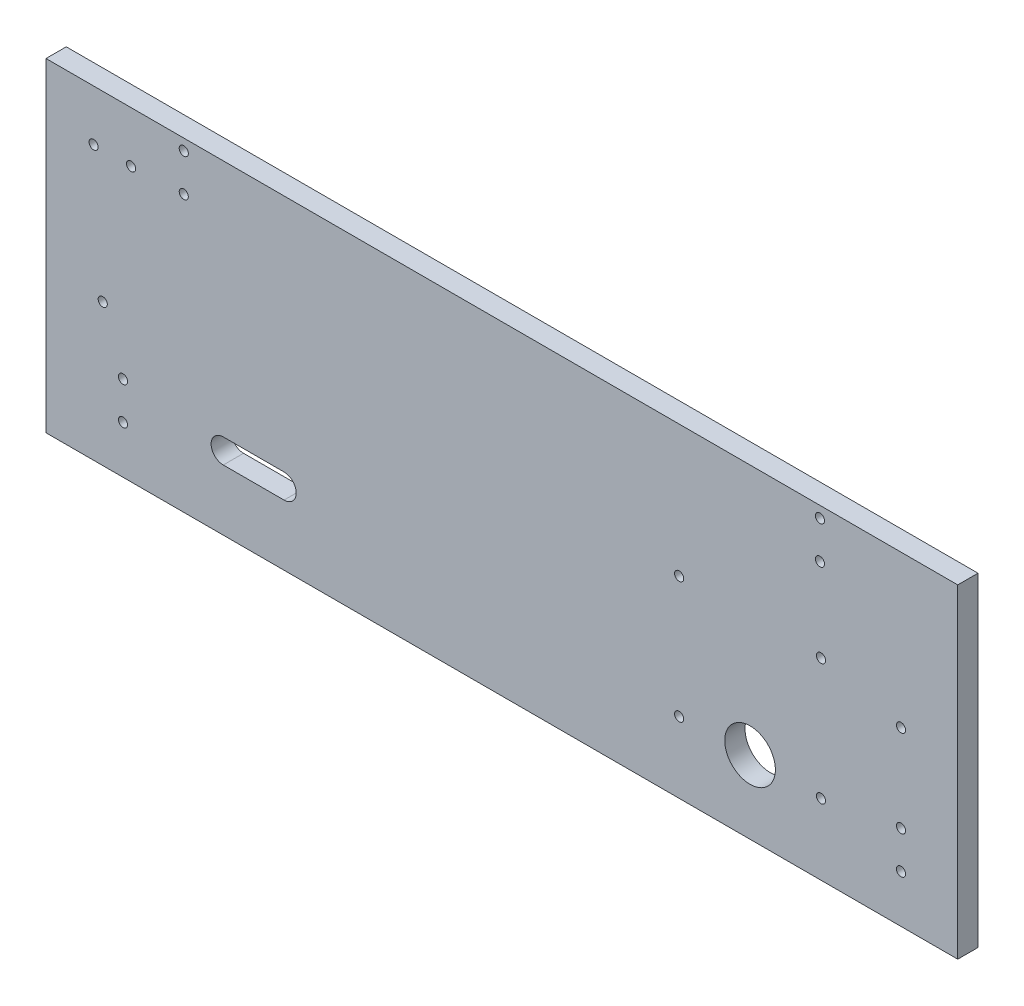
ISO-10303-21;
HEADER;
FILE_DESCRIPTION(('STEP AP214'),'2;1');
FILE_NAME('part.step','',(''),(''),'','','');
FILE_SCHEMA(('AUTOMOTIVE_DESIGN { 1 0 10303 214 1 1 1 1 }'));
ENDSEC;
DATA;
#1=APPLICATION_CONTEXT('core data for automotive mechanical design processes');
#2=APPLICATION_PROTOCOL_DEFINITION('international standard','automotive_design',2000,#1);
#3=PRODUCT_CONTEXT('',#1,'mechanical');
#4=PRODUCT('Part','Part','',(#3));
#5=PRODUCT_RELATED_PRODUCT_CATEGORY('part','',(#4));
#6=PRODUCT_DEFINITION_FORMATION('','',#4);
#7=PRODUCT_DEFINITION_CONTEXT('part definition',#1,'design');
#8=PRODUCT_DEFINITION('design','',#6,#7);
#9=PRODUCT_DEFINITION_SHAPE('','',#8);
#10=(LENGTH_UNIT() NAMED_UNIT(*) SI_UNIT(.MILLI.,.METRE.));
#11=(NAMED_UNIT(*) PLANE_ANGLE_UNIT() SI_UNIT($,.RADIAN.));
#12=(NAMED_UNIT(*) SI_UNIT($,.STERADIAN.) SOLID_ANGLE_UNIT());
#13=UNCERTAINTY_MEASURE_WITH_UNIT(LENGTH_MEASURE(1.E-05),#10,'distance_accuracy_value','');
#14=(GEOMETRIC_REPRESENTATION_CONTEXT(3) GLOBAL_UNCERTAINTY_ASSIGNED_CONTEXT((#13)) GLOBAL_UNIT_ASSIGNED_CONTEXT((#10,
#11,#12)) REPRESENTATION_CONTEXT('',''));
#15=CARTESIAN_POINT('',(0.,0.,0.));
#16=DIRECTION('',(0.,0.,1.));
#17=DIRECTION('',(1.,0.,0.));
#18=AXIS2_PLACEMENT_3D('',#15,#16,#17);
#19=CARTESIAN_POINT('',(0.,0.,10.));
#20=DIRECTION('',(1.,0.,0.));
#21=DIRECTION('',(0.,0.,-1.));
#22=AXIS2_PLACEMENT_3D('',#19,#20,#21);
#23=PLANE('',#22);
#24=DIRECTION('',(0.,-1.,0.));
#25=VECTOR('',#24,1.);
#26=CARTESIAN_POINT('',(0.,0.,0.));
#27=LINE('',#26,#25);
#28=CARTESIAN_POINT('',(0.,160.,0.));
#29=VERTEX_POINT('',#28);
#30=CARTESIAN_POINT('',(0.,0.,0.));
#31=VERTEX_POINT('',#30);
#32=EDGE_CURVE('E160',#29,#31,#27,.T.);
#33=ORIENTED_EDGE('',*,*,#32,.T.);
#34=DIRECTION('',(0.,0.,-1.));
#35=VECTOR('',#34,1.);
#36=CARTESIAN_POINT('',(0.,0.,10.));
#37=LINE('',#36,#35);
#38=CARTESIAN_POINT('',(0.,0.,10.));
#39=VERTEX_POINT('',#38);
#40=EDGE_CURVE('E11',#39,#31,#37,.T.);
#41=ORIENTED_EDGE('',*,*,#40,.F.);
#42=DIRECTION('',(0.,-1.,0.));
#43=VECTOR('',#42,1.);
#44=CARTESIAN_POINT('',(0.,0.,10.));
#45=LINE('',#44,#43);
#46=CARTESIAN_POINT('',(0.,160.,10.));
#47=VERTEX_POINT('',#46);
#48=EDGE_CURVE('E162',#47,#39,#45,.T.);
#49=ORIENTED_EDGE('',*,*,#48,.F.);
#50=DIRECTION('',(0.,0.,-1.));
#51=VECTOR('',#50,1.);
#52=CARTESIAN_POINT('',(0.,160.,10.));
#53=LINE('',#52,#51);
#54=EDGE_CURVE('E172',#47,#29,#53,.T.);
#55=ORIENTED_EDGE('',*,*,#54,.T.);
#56=EDGE_LOOP('',(#33,#41,#49,#55));
#57=FACE_BOUND('',#56,.T.);
#58=ADVANCED_FACE('F39',(#57),#23,.F.);
#59=CARTESIAN_POINT('',(0.,0.,10.));
#60=DIRECTION('',(0.,1.,0.));
#61=DIRECTION('',(0.,0.,1.));
#62=AXIS2_PLACEMENT_3D('',#59,#60,#61);
#63=PLANE('',#62);
#64=DIRECTION('',(1.,0.,0.));
#65=VECTOR('',#64,1.);
#66=CARTESIAN_POINT('',(0.,0.,0.));
#67=LINE('',#66,#65);
#68=CARTESIAN_POINT('',(450.,0.,0.));
#69=VERTEX_POINT('',#68);
#70=EDGE_CURVE('E175',#31,#69,#67,.T.);
#71=ORIENTED_EDGE('',*,*,#70,.T.);
#72=DIRECTION('',(0.,0.,-1.));
#73=VECTOR('',#72,1.);
#74=CARTESIAN_POINT('',(450.,0.,10.));
#75=LINE('',#74,#73);
#76=CARTESIAN_POINT('',(450.,0.,10.));
#77=VERTEX_POINT('',#76);
#78=EDGE_CURVE('E46',#77,#69,#75,.T.);
#79=ORIENTED_EDGE('',*,*,#78,.F.);
#80=DIRECTION('',(1.,0.,0.));
#81=VECTOR('',#80,1.);
#82=CARTESIAN_POINT('',(0.,0.,10.));
#83=LINE('',#82,#81);
#84=EDGE_CURVE('E165',#39,#77,#83,.T.);
#85=ORIENTED_EDGE('',*,*,#84,.F.);
#86=ORIENTED_EDGE('',*,*,#40,.T.);
#87=EDGE_LOOP('',(#71,#79,#85,#86));
#88=FACE_BOUND('',#87,.T.);
#89=ADVANCED_FACE('F204',(#88),#63,.F.);
#90=CARTESIAN_POINT('',(450.,0.,10.));
#91=DIRECTION('',(-1.,0.,0.));
#92=DIRECTION('',(0.,0.,1.));
#93=AXIS2_PLACEMENT_3D('',#90,#91,#92);
#94=PLANE('',#93);
#95=DIRECTION('',(0.,1.,0.));
#96=VECTOR('',#95,1.);
#97=CARTESIAN_POINT('',(450.,0.,0.));
#98=LINE('',#97,#96);
#99=CARTESIAN_POINT('',(450.,160.,0.));
#100=VERTEX_POINT('',#99);
#101=EDGE_CURVE('E177',#69,#100,#98,.T.);
#102=ORIENTED_EDGE('',*,*,#101,.T.);
#103=DIRECTION('',(0.,0.,-1.));
#104=VECTOR('',#103,1.);
#105=CARTESIAN_POINT('',(450.,160.,10.));
#106=LINE('',#105,#104);
#107=CARTESIAN_POINT('',(450.,160.,10.));
#108=VERTEX_POINT('',#107);
#109=EDGE_CURVE('E182',#108,#100,#106,.T.);
#110=ORIENTED_EDGE('',*,*,#109,.F.);
#111=DIRECTION('',(0.,1.,0.));
#112=VECTOR('',#111,1.);
#113=CARTESIAN_POINT('',(450.,0.,10.));
#114=LINE('',#113,#112);
#115=EDGE_CURVE('E168',#77,#108,#114,.T.);
#116=ORIENTED_EDGE('',*,*,#115,.F.);
#117=ORIENTED_EDGE('',*,*,#78,.T.);
#118=EDGE_LOOP('',(#102,#110,#116,#117));
#119=FACE_BOUND('',#118,.T.);
#120=ADVANCED_FACE('F189',(#119),#94,.F.);
#121=CARTESIAN_POINT('',(0.,160.,10.));
#122=DIRECTION('',(0.,-1.,0.));
#123=DIRECTION('',(0.,0.,-1.));
#124=AXIS2_PLACEMENT_3D('',#121,#122,#123);
#125=PLANE('',#124);
#126=DIRECTION('',(-1.,0.,0.));
#127=VECTOR('',#126,1.);
#128=CARTESIAN_POINT('',(0.,160.,0.));
#129=LINE('',#128,#127);
#130=EDGE_CURVE('E166',#100,#29,#129,.T.);
#131=ORIENTED_EDGE('',*,*,#130,.T.);
#132=ORIENTED_EDGE('',*,*,#54,.F.);
#133=DIRECTION('',(-1.,0.,0.));
#134=VECTOR('',#133,1.);
#135=CARTESIAN_POINT('',(0.,160.,10.));
#136=LINE('',#135,#134);
#137=EDGE_CURVE('E170',#108,#47,#136,.T.);
#138=ORIENTED_EDGE('',*,*,#137,.F.);
#139=ORIENTED_EDGE('',*,*,#109,.T.);
#140=EDGE_LOOP('',(#131,#132,#138,#139));
#141=FACE_BOUND('',#140,.T.);
#142=ADVANCED_FACE('F198',(#141),#125,.F.);
#143=CARTESIAN_POINT('',(0.,0.,10.));
#144=DIRECTION('',(0.,0.,-1.));
#145=DIRECTION('',(-1.,0.,0.));
#146=AXIS2_PLACEMENT_3D('',#143,#144,#145);
#147=PLANE('',#146);
#148=CARTESIAN_POINT('',(68.0000000000001,154.5,10.));
#149=DIRECTION('',(0.,0.,1.));
#150=DIRECTION('',(1.,0.,0.));
#151=AXIS2_PLACEMENT_3D('',#148,#149,#150);
#152=CIRCLE('',#151,2.25);
#153=CARTESIAN_POINT('',(70.2500000000001,154.5,10.));
#154=VERTEX_POINT('',#153);
#155=EDGE_CURVE('E343',#154,#154,#152,.T.);
#156=ORIENTED_EDGE('',*,*,#155,.F.);
#157=EDGE_LOOP('',(#156));
#158=FACE_BOUND('',#157,.T.);
#159=CARTESIAN_POINT('',(382.,136.,10.));
#160=DIRECTION('',(0.,0.,1.));
#161=DIRECTION('',(1.,0.,0.));
#162=AXIS2_PLACEMENT_3D('',#159,#160,#161);
#163=CIRCLE('',#162,2.24999999999996);
#164=CARTESIAN_POINT('',(384.25,136.,10.));
#165=VERTEX_POINT('',#164);
#166=EDGE_CURVE('E336',#165,#165,#163,.T.);
#167=ORIENTED_EDGE('',*,*,#166,.F.);
#168=EDGE_LOOP('',(#167));
#169=FACE_BOUND('',#168,.T.);
#170=CARTESIAN_POINT('',(382.,154.5,10.));
#171=DIRECTION('',(0.,0.,1.));
#172=DIRECTION('',(1.,0.,0.));
#173=AXIS2_PLACEMENT_3D('',#170,#171,#172);
#174=CIRCLE('',#173,2.24999999999996);
#175=CARTESIAN_POINT('',(384.25,154.5,10.));
#176=VERTEX_POINT('',#175);
#177=EDGE_CURVE('E355',#176,#176,#174,.T.);
#178=ORIENTED_EDGE('',*,*,#177,.F.);
#179=EDGE_LOOP('',(#178));
#180=FACE_BOUND('',#179,.T.);
#181=CARTESIAN_POINT('',(422.,84.9999999999999,10.));
#182=DIRECTION('',(0.,0.,1.));
#183=DIRECTION('',(1.,0.,0.));
#184=AXIS2_PLACEMENT_3D('',#181,#182,#183);
#185=CIRCLE('',#184,2.24999999999995);
#186=CARTESIAN_POINT('',(424.25,84.9999999999999,10.));
#187=VERTEX_POINT('',#186);
#188=EDGE_CURVE('E348',#187,#187,#185,.T.);
#189=ORIENTED_EDGE('',*,*,#188,.F.);
#190=EDGE_LOOP('',(#189));
#191=FACE_BOUND('',#190,.T.);
#192=CARTESIAN_POINT('',(68.0000000000001,136.,10.));
#193=DIRECTION('',(0.,0.,1.));
#194=DIRECTION('',(1.,0.,0.));
#195=AXIS2_PLACEMENT_3D('',#192,#193,#194);
#196=CIRCLE('',#195,2.25);
#197=CARTESIAN_POINT('',(70.2500000000001,136.,10.));
#198=VERTEX_POINT('',#197);
#199=EDGE_CURVE('E315',#198,#198,#196,.T.);
#200=ORIENTED_EDGE('',*,*,#199,.F.);
#201=EDGE_LOOP('',(#200));
#202=FACE_BOUND('',#201,.T.);
#203=CARTESIAN_POINT('',(38.,42.,10.));
#204=DIRECTION('',(0.,0.,1.));
#205=DIRECTION('',(1.,0.,0.));
#206=AXIS2_PLACEMENT_3D('',#203,#204,#205);
#207=CIRCLE('',#206,2.25);
#208=CARTESIAN_POINT('',(40.25,42.,10.));
#209=VERTEX_POINT('',#208);
#210=EDGE_CURVE('E322',#209,#209,#207,.T.);
#211=ORIENTED_EDGE('',*,*,#210,.F.);
#212=EDGE_LOOP('',(#211));
#213=FACE_BOUND('',#212,.T.);
#214=CARTESIAN_POINT('',(38.,23.5,10.));
#215=DIRECTION('',(0.,0.,1.));
#216=DIRECTION('',(1.,0.,0.));
#217=AXIS2_PLACEMENT_3D('',#214,#215,#216);
#218=CIRCLE('',#217,2.25);
#219=CARTESIAN_POINT('',(40.25,23.5,10.));
#220=VERTEX_POINT('',#219);
#221=EDGE_CURVE('E328',#220,#220,#218,.T.);
#222=ORIENTED_EDGE('',*,*,#221,.F.);
#223=EDGE_LOOP('',(#222));
#224=FACE_BOUND('',#223,.T.);
#225=CARTESIAN_POINT('',(422.,23.4999999999999,10.));
#226=DIRECTION('',(0.,0.,1.));
#227=DIRECTION('',(1.,0.,0.));
#228=AXIS2_PLACEMENT_3D('',#225,#226,#227);
#229=CIRCLE('',#228,2.24999999999995);
#230=CARTESIAN_POINT('',(424.25,23.4999999999999,10.));
#231=VERTEX_POINT('',#230);
#232=EDGE_CURVE('E311',#231,#231,#229,.T.);
#233=ORIENTED_EDGE('',*,*,#232,.F.);
#234=EDGE_LOOP('',(#233));
#235=FACE_BOUND('',#234,.T.);
#236=DIRECTION('',(1.,0.,0.));
#237=VECTOR('',#236,1.);
#238=CARTESIAN_POINT('',(87.5,30.,10.));
#239=LINE('',#238,#237);
#240=CARTESIAN_POINT('',(87.5,30.,10.));
#241=VERTEX_POINT('',#240);
#242=CARTESIAN_POINT('',(117.5,30.,10.));
#243=VERTEX_POINT('',#242);
#244=EDGE_CURVE('E124',#241,#243,#239,.T.);
#245=ORIENTED_EDGE('',*,*,#244,.F.);
#246=CARTESIAN_POINT('',(87.5,36.,10.));
#247=DIRECTION('',(0.,0.,1.));
#248=DIRECTION('',(1.,0.,0.));
#249=AXIS2_PLACEMENT_3D('',#246,#247,#248);
#250=CIRCLE('',#249,6.);
#251=CARTESIAN_POINT('',(87.5,42.,10.));
#252=VERTEX_POINT('',#251);
#253=EDGE_CURVE('E53',#252,#241,#250,.T.);
#254=ORIENTED_EDGE('',*,*,#253,.F.);
#255=DIRECTION('',(-1.,0.,0.));
#256=VECTOR('',#255,1.);
#257=CARTESIAN_POINT('',(87.5,42.,10.));
#258=LINE('',#257,#256);
#259=CARTESIAN_POINT('',(117.5,42.,10.));
#260=VERTEX_POINT('',#259);
#261=EDGE_CURVE('E113',#260,#252,#258,.T.);
#262=ORIENTED_EDGE('',*,*,#261,.F.);
#263=CARTESIAN_POINT('',(117.5,36.,10.));
#264=DIRECTION('',(0.,0.,1.));
#265=DIRECTION('',(1.,0.,0.));
#266=AXIS2_PLACEMENT_3D('',#263,#264,#265);
#267=CIRCLE('',#266,6.);
#268=EDGE_CURVE('E118',#243,#260,#267,.T.);
#269=ORIENTED_EDGE('',*,*,#268,.F.);
#270=EDGE_LOOP('',(#245,#254,#262,#269));
#271=FACE_BOUND('',#270,.T.);
#272=CARTESIAN_POINT('',(312.5,94.9999999999998,10.));
#273=DIRECTION('',(0.,0.,1.));
#274=DIRECTION('',(1.,0.,0.));
#275=AXIS2_PLACEMENT_3D('',#272,#273,#274);
#276=CIRCLE('',#275,2.24999999999995);
#277=CARTESIAN_POINT('',(314.75,94.9999999999998,10.));
#278=VERTEX_POINT('',#277);
#279=EDGE_CURVE('E110',#278,#278,#276,.T.);
#280=ORIENTED_EDGE('',*,*,#279,.F.);
#281=EDGE_LOOP('',(#280));
#282=FACE_BOUND('',#281,.T.);
#283=CARTESIAN_POINT('',(382.5,94.9999999999998,10.));
#284=DIRECTION('',(0.,0.,1.));
#285=DIRECTION('',(1.,0.,0.));
#286=AXIS2_PLACEMENT_3D('',#283,#284,#285);
#287=CIRCLE('',#286,2.25000000000001);
#288=CARTESIAN_POINT('',(384.75,94.9999999999998,10.));
#289=VERTEX_POINT('',#288);
#290=EDGE_CURVE('E146',#289,#289,#287,.T.);
#291=ORIENTED_EDGE('',*,*,#290,.F.);
#292=EDGE_LOOP('',(#291));
#293=FACE_BOUND('',#292,.T.);
#294=CARTESIAN_POINT('',(382.5,34.9999999999998,10.));
#295=DIRECTION('',(0.,0.,1.));
#296=DIRECTION('',(1.,0.,0.));
#297=AXIS2_PLACEMENT_3D('',#294,#295,#296);
#298=CIRCLE('',#297,2.24999999999995);
#299=CARTESIAN_POINT('',(384.75,34.9999999999998,10.));
#300=VERTEX_POINT('',#299);
#301=EDGE_CURVE('E152',#300,#300,#298,.T.);
#302=ORIENTED_EDGE('',*,*,#301,.F.);
#303=EDGE_LOOP('',(#302));
#304=FACE_BOUND('',#303,.T.);
#305=CARTESIAN_POINT('',(28.0000000000001,70.,10.));
#306=DIRECTION('',(0.,0.,1.));
#307=DIRECTION('',(1.,0.,0.));
#308=AXIS2_PLACEMENT_3D('',#305,#306,#307);
#309=CIRCLE('',#308,2.25);
#310=CARTESIAN_POINT('',(30.2500000000001,70.,10.));
#311=VERTEX_POINT('',#310);
#312=EDGE_CURVE('E367',#311,#311,#309,.T.);
#313=ORIENTED_EDGE('',*,*,#312,.F.);
#314=EDGE_LOOP('',(#313));
#315=FACE_BOUND('',#314,.T.);
#316=CARTESIAN_POINT('',(42.,134.933694221876,10.));
#317=DIRECTION('',(0.,0.,1.));
#318=DIRECTION('',(1.,0.,0.));
#319=AXIS2_PLACEMENT_3D('',#316,#317,#318);
#320=CIRCLE('',#319,2.25);
#321=CARTESIAN_POINT('',(44.25,134.933694221876,10.));
#322=VERTEX_POINT('',#321);
#323=EDGE_CURVE('E360',#322,#322,#320,.T.);
#324=ORIENTED_EDGE('',*,*,#323,.F.);
#325=EDGE_LOOP('',(#324));
#326=FACE_BOUND('',#325,.T.);
#327=CARTESIAN_POINT('',(23.5,134.933694221876,10.));
#328=DIRECTION('',(0.,0.,1.));
#329=DIRECTION('',(1.,0.,0.));
#330=AXIS2_PLACEMENT_3D('',#327,#328,#329);
#331=CIRCLE('',#330,2.25);
#332=CARTESIAN_POINT('',(25.75,134.933694221876,10.));
#333=VERTEX_POINT('',#332);
#334=EDGE_CURVE('E377',#333,#333,#331,.T.);
#335=ORIENTED_EDGE('',*,*,#334,.F.);
#336=EDGE_LOOP('',(#335));
#337=FACE_BOUND('',#336,.T.);
#338=CARTESIAN_POINT('',(312.5,34.9999999999998,10.));
#339=DIRECTION('',(0.,0.,1.));
#340=DIRECTION('',(1.,0.,0.));
#341=AXIS2_PLACEMENT_3D('',#338,#339,#340);
#342=CIRCLE('',#341,2.24999999999995);
#343=CARTESIAN_POINT('',(314.75,34.9999999999998,10.));
#344=VERTEX_POINT('',#343);
#345=EDGE_CURVE('E158',#344,#344,#342,.T.);
#346=ORIENTED_EDGE('',*,*,#345,.F.);
#347=EDGE_LOOP('',(#346));
#348=FACE_BOUND('',#347,.T.);
#349=CARTESIAN_POINT('',(422.,41.9999999999999,10.));
#350=DIRECTION('',(0.,0.,1.));
#351=DIRECTION('',(1.,0.,0.));
#352=AXIS2_PLACEMENT_3D('',#349,#350,#351);
#353=CIRCLE('',#352,2.24999999999995);
#354=CARTESIAN_POINT('',(424.25,41.9999999999999,10.));
#355=VERTEX_POINT('',#354);
#356=EDGE_CURVE('E306',#355,#355,#353,.T.);
#357=ORIENTED_EDGE('',*,*,#356,.F.);
#358=EDGE_LOOP('',(#357));
#359=FACE_BOUND('',#358,.T.);
#360=CARTESIAN_POINT('',(347.5,36.,10.));
#361=DIRECTION('',(0.,0.,1.));
#362=DIRECTION('',(1.,0.,0.));
#363=AXIS2_PLACEMENT_3D('',#360,#361,#362);
#364=CIRCLE('',#363,12.5);
#365=CARTESIAN_POINT('',(360.,36.,10.));
#366=VERTEX_POINT('',#365);
#367=EDGE_CURVE('E125',#366,#366,#364,.T.);
#368=ORIENTED_EDGE('',*,*,#367,.F.);
#369=EDGE_LOOP('',(#368));
#370=FACE_BOUND('',#369,.T.);
#371=ORIENTED_EDGE('',*,*,#48,.T.);
#372=ORIENTED_EDGE('',*,*,#84,.T.);
#373=ORIENTED_EDGE('',*,*,#115,.T.);
#374=ORIENTED_EDGE('',*,*,#137,.T.);
#375=EDGE_LOOP('',(#371,#372,#373,#374));
#376=FACE_BOUND('',#375,.T.);
#377=ADVANCED_FACE('F121',(#158,#169,#180,#191,#202,#213,#224,#235,#271,#282,#293,#304,#315,
#326,#337,#348,#359,#370,#376),#147,.F.);
#378=CARTESIAN_POINT('',(0.,0.,0.));
#379=DIRECTION('',(0.,0.,-1.));
#380=DIRECTION('',(-1.,0.,0.));
#381=AXIS2_PLACEMENT_3D('',#378,#379,#380);
#382=PLANE('',#381);
#383=CARTESIAN_POINT('',(68.0000000000001,154.5,0.));
#384=DIRECTION('',(0.,0.,1.));
#385=DIRECTION('',(1.,0.,0.));
#386=AXIS2_PLACEMENT_3D('',#383,#384,#385);
#387=CIRCLE('',#386,2.25);
#388=CARTESIAN_POINT('',(70.2500000000001,154.5,0.));
#389=VERTEX_POINT('',#388);
#390=EDGE_CURVE('E318',#389,#389,#387,.T.);
#391=ORIENTED_EDGE('',*,*,#390,.T.);
#392=EDGE_LOOP('',(#391));
#393=FACE_BOUND('',#392,.T.);
#394=CARTESIAN_POINT('',(382.,136.,0.));
#395=DIRECTION('',(0.,0.,1.));
#396=DIRECTION('',(1.,0.,0.));
#397=AXIS2_PLACEMENT_3D('',#394,#395,#396);
#398=CIRCLE('',#397,2.24999999999996);
#399=CARTESIAN_POINT('',(384.25,136.,0.));
#400=VERTEX_POINT('',#399);
#401=EDGE_CURVE('E340',#400,#400,#398,.T.);
#402=ORIENTED_EDGE('',*,*,#401,.T.);
#403=EDGE_LOOP('',(#402));
#404=FACE_BOUND('',#403,.T.);
#405=CARTESIAN_POINT('',(382.,154.5,0.));
#406=DIRECTION('',(0.,0.,1.));
#407=DIRECTION('',(1.,0.,0.));
#408=AXIS2_PLACEMENT_3D('',#405,#406,#407);
#409=CIRCLE('',#408,2.24999999999996);
#410=CARTESIAN_POINT('',(384.25,154.5,0.));
#411=VERTEX_POINT('',#410);
#412=EDGE_CURVE('E339',#411,#411,#409,.T.);
#413=ORIENTED_EDGE('',*,*,#412,.T.);
#414=EDGE_LOOP('',(#413));
#415=FACE_BOUND('',#414,.T.);
#416=CARTESIAN_POINT('',(422.,84.9999999999999,0.));
#417=DIRECTION('',(0.,0.,1.));
#418=DIRECTION('',(1.,0.,0.));
#419=AXIS2_PLACEMENT_3D('',#416,#417,#418);
#420=CIRCLE('',#419,2.24999999999995);
#421=CARTESIAN_POINT('',(424.25,84.9999999999999,0.));
#422=VERTEX_POINT('',#421);
#423=EDGE_CURVE('E352',#422,#422,#420,.T.);
#424=ORIENTED_EDGE('',*,*,#423,.T.);
#425=EDGE_LOOP('',(#424));
#426=FACE_BOUND('',#425,.T.);
#427=CARTESIAN_POINT('',(68.0000000000001,136.,0.));
#428=DIRECTION('',(0.,0.,1.));
#429=DIRECTION('',(1.,0.,0.));
#430=AXIS2_PLACEMENT_3D('',#427,#428,#429);
#431=CIRCLE('',#430,2.25);
#432=CARTESIAN_POINT('',(70.2500000000001,136.,0.));
#433=VERTEX_POINT('',#432);
#434=EDGE_CURVE('E319',#433,#433,#431,.T.);
#435=ORIENTED_EDGE('',*,*,#434,.T.);
#436=EDGE_LOOP('',(#435));
#437=FACE_BOUND('',#436,.T.);
#438=CARTESIAN_POINT('',(38.,42.,0.));
#439=DIRECTION('',(0.,0.,1.));
#440=DIRECTION('',(1.,0.,0.));
#441=AXIS2_PLACEMENT_3D('',#438,#439,#440);
#442=CIRCLE('',#441,2.25);
#443=CARTESIAN_POINT('',(40.25,42.,0.));
#444=VERTEX_POINT('',#443);
#445=EDGE_CURVE('E325',#444,#444,#442,.T.);
#446=ORIENTED_EDGE('',*,*,#445,.T.);
#447=EDGE_LOOP('',(#446));
#448=FACE_BOUND('',#447,.T.);
#449=CARTESIAN_POINT('',(38.,23.5,0.));
#450=DIRECTION('',(0.,0.,1.));
#451=DIRECTION('',(1.,0.,0.));
#452=AXIS2_PLACEMENT_3D('',#449,#450,#451);
#453=CIRCLE('',#452,2.25);
#454=CARTESIAN_POINT('',(40.25,23.5,0.));
#455=VERTEX_POINT('',#454);
#456=EDGE_CURVE('E331',#455,#455,#453,.T.);
#457=ORIENTED_EDGE('',*,*,#456,.T.);
#458=EDGE_LOOP('',(#457));
#459=FACE_BOUND('',#458,.T.);
#460=CARTESIAN_POINT('',(422.,23.4999999999999,0.));
#461=DIRECTION('',(0.,0.,1.));
#462=DIRECTION('',(1.,0.,0.));
#463=AXIS2_PLACEMENT_3D('',#460,#461,#462);
#464=CIRCLE('',#463,2.24999999999995);
#465=CARTESIAN_POINT('',(424.25,23.4999999999999,0.));
#466=VERTEX_POINT('',#465);
#467=EDGE_CURVE('E308',#466,#466,#464,.T.);
#468=ORIENTED_EDGE('',*,*,#467,.T.);
#469=EDGE_LOOP('',(#468));
#470=FACE_BOUND('',#469,.T.);
#471=CARTESIAN_POINT('',(87.5,36.,0.));
#472=DIRECTION('',(0.,0.,1.));
#473=DIRECTION('',(1.,0.,0.));
#474=AXIS2_PLACEMENT_3D('',#471,#472,#473);
#475=CIRCLE('',#474,6.);
#476=CARTESIAN_POINT('',(87.5,42.,0.));
#477=VERTEX_POINT('',#476);
#478=CARTESIAN_POINT('',(87.5,30.,0.));
#479=VERTEX_POINT('',#478);
#480=EDGE_CURVE('E105',#477,#479,#475,.T.);
#481=ORIENTED_EDGE('',*,*,#480,.T.);
#482=DIRECTION('',(1.,0.,0.));
#483=VECTOR('',#482,1.);
#484=CARTESIAN_POINT('',(87.5,30.,0.));
#485=LINE('',#484,#483);
#486=CARTESIAN_POINT('',(117.5,30.,0.));
#487=VERTEX_POINT('',#486);
#488=EDGE_CURVE('E137',#479,#487,#485,.T.);
#489=ORIENTED_EDGE('',*,*,#488,.T.);
#490=CARTESIAN_POINT('',(117.5,36.,0.));
#491=DIRECTION('',(0.,0.,1.));
#492=DIRECTION('',(1.,0.,0.));
#493=AXIS2_PLACEMENT_3D('',#490,#491,#492);
#494=CIRCLE('',#493,6.);
#495=CARTESIAN_POINT('',(117.5,42.,0.));
#496=VERTEX_POINT('',#495);
#497=EDGE_CURVE('E61',#487,#496,#494,.T.);
#498=ORIENTED_EDGE('',*,*,#497,.T.);
#499=DIRECTION('',(-1.,0.,0.));
#500=VECTOR('',#499,1.);
#501=CARTESIAN_POINT('',(87.5,42.,0.));
#502=LINE('',#501,#500);
#503=EDGE_CURVE('E133',#496,#477,#502,.T.);
#504=ORIENTED_EDGE('',*,*,#503,.T.);
#505=EDGE_LOOP('',(#481,#489,#498,#504));
#506=FACE_BOUND('',#505,.T.);
#507=CARTESIAN_POINT('',(312.5,94.9999999999998,0.));
#508=DIRECTION('',(0.,0.,1.));
#509=DIRECTION('',(1.,0.,0.));
#510=AXIS2_PLACEMENT_3D('',#507,#508,#509);
#511=CIRCLE('',#510,2.24999999999995);
#512=CARTESIAN_POINT('',(314.75,94.9999999999998,0.));
#513=VERTEX_POINT('',#512);
#514=EDGE_CURVE('E143',#513,#513,#511,.T.);
#515=ORIENTED_EDGE('',*,*,#514,.T.);
#516=EDGE_LOOP('',(#515));
#517=FACE_BOUND('',#516,.T.);
#518=CARTESIAN_POINT('',(382.5,94.9999999999998,0.));
#519=DIRECTION('',(0.,0.,1.));
#520=DIRECTION('',(1.,0.,0.));
#521=AXIS2_PLACEMENT_3D('',#518,#519,#520);
#522=CIRCLE('',#521,2.25000000000001);
#523=CARTESIAN_POINT('',(384.75,94.9999999999998,0.));
#524=VERTEX_POINT('',#523);
#525=EDGE_CURVE('E149',#524,#524,#522,.T.);
#526=ORIENTED_EDGE('',*,*,#525,.T.);
#527=EDGE_LOOP('',(#526));
#528=FACE_BOUND('',#527,.T.);
#529=CARTESIAN_POINT('',(382.5,34.9999999999998,0.));
#530=DIRECTION('',(0.,0.,1.));
#531=DIRECTION('',(1.,0.,0.));
#532=AXIS2_PLACEMENT_3D('',#529,#530,#531);
#533=CIRCLE('',#532,2.24999999999995);
#534=CARTESIAN_POINT('',(384.75,34.9999999999998,0.));
#535=VERTEX_POINT('',#534);
#536=EDGE_CURVE('E155',#535,#535,#533,.T.);
#537=ORIENTED_EDGE('',*,*,#536,.T.);
#538=EDGE_LOOP('',(#537));
#539=FACE_BOUND('',#538,.T.);
#540=CARTESIAN_POINT('',(28.0000000000001,70.,0.));
#541=DIRECTION('',(0.,0.,1.));
#542=DIRECTION('',(1.,0.,0.));
#543=AXIS2_PLACEMENT_3D('',#540,#541,#542);
#544=CIRCLE('',#543,2.25);
#545=CARTESIAN_POINT('',(30.2500000000001,70.,0.));
#546=VERTEX_POINT('',#545);
#547=EDGE_CURVE('E351',#546,#546,#544,.T.);
#548=ORIENTED_EDGE('',*,*,#547,.T.);
#549=EDGE_LOOP('',(#548));
#550=FACE_BOUND('',#549,.T.);
#551=CARTESIAN_POINT('',(42.,134.933694221876,0.));
#552=DIRECTION('',(0.,0.,1.));
#553=DIRECTION('',(1.,0.,0.));
#554=AXIS2_PLACEMENT_3D('',#551,#552,#553);
#555=CIRCLE('',#554,2.25);
#556=CARTESIAN_POINT('',(44.25,134.933694221876,0.));
#557=VERTEX_POINT('',#556);
#558=EDGE_CURVE('E364',#557,#557,#555,.T.);
#559=ORIENTED_EDGE('',*,*,#558,.T.);
#560=EDGE_LOOP('',(#559));
#561=FACE_BOUND('',#560,.T.);
#562=CARTESIAN_POINT('',(23.5,134.933694221876,0.));
#563=DIRECTION('',(0.,0.,1.));
#564=DIRECTION('',(1.,0.,0.));
#565=AXIS2_PLACEMENT_3D('',#562,#563,#564);
#566=CIRCLE('',#565,2.25);
#567=CARTESIAN_POINT('',(25.75,134.933694221876,0.));
#568=VERTEX_POINT('',#567);
#569=EDGE_CURVE('E363',#568,#568,#566,.T.);
#570=ORIENTED_EDGE('',*,*,#569,.T.);
#571=EDGE_LOOP('',(#570));
#572=FACE_BOUND('',#571,.T.);
#573=CARTESIAN_POINT('',(312.5,34.9999999999998,0.));
#574=DIRECTION('',(0.,0.,1.));
#575=DIRECTION('',(1.,0.,0.));
#576=AXIS2_PLACEMENT_3D('',#573,#574,#575);
#577=CIRCLE('',#576,2.24999999999995);
#578=CARTESIAN_POINT('',(314.75,34.9999999999998,0.));
#579=VERTEX_POINT('',#578);
#580=EDGE_CURVE('E374',#579,#579,#577,.T.);
#581=ORIENTED_EDGE('',*,*,#580,.T.);
#582=EDGE_LOOP('',(#581));
#583=FACE_BOUND('',#582,.T.);
#584=CARTESIAN_POINT('',(422.,41.9999999999999,0.));
#585=DIRECTION('',(0.,0.,1.));
#586=DIRECTION('',(1.,0.,0.));
#587=AXIS2_PLACEMENT_3D('',#584,#585,#586);
#588=CIRCLE('',#587,2.24999999999995);
#589=CARTESIAN_POINT('',(424.25,41.9999999999999,0.));
#590=VERTEX_POINT('',#589);
#591=EDGE_CURVE('E303',#590,#590,#588,.T.);
#592=ORIENTED_EDGE('',*,*,#591,.T.);
#593=EDGE_LOOP('',(#592));
#594=FACE_BOUND('',#593,.T.);
#595=CARTESIAN_POINT('',(347.5,36.,0.));
#596=DIRECTION('',(0.,0.,1.));
#597=DIRECTION('',(1.,0.,0.));
#598=AXIS2_PLACEMENT_3D('',#595,#596,#597);
#599=CIRCLE('',#598,12.5);
#600=CARTESIAN_POINT('',(360.,36.,0.));
#601=VERTEX_POINT('',#600);
#602=EDGE_CURVE('E128',#601,#601,#599,.T.);
#603=ORIENTED_EDGE('',*,*,#602,.T.);
#604=EDGE_LOOP('',(#603));
#605=FACE_BOUND('',#604,.T.);
#606=ORIENTED_EDGE('',*,*,#32,.F.);
#607=ORIENTED_EDGE('',*,*,#130,.F.);
#608=ORIENTED_EDGE('',*,*,#101,.F.);
#609=ORIENTED_EDGE('',*,*,#70,.F.);
#610=EDGE_LOOP('',(#606,#607,#608,#609));
#611=FACE_BOUND('',#610,.T.);
#612=ADVANCED_FACE('F195',(#393,#404,#415,#426,#437,#448,#459,#470,#506,#517,#528,#539,#550,
#561,#572,#583,#594,#605,#611),#382,.T.);
#613=CARTESIAN_POINT('',(347.5,36.,0.));
#614=DIRECTION('',(0.,0.,1.));
#615=DIRECTION('',(1.,0.,0.));
#616=AXIS2_PLACEMENT_3D('',#613,#614,#615);
#617=CYLINDRICAL_SURFACE('',#616,12.5);
#618=ORIENTED_EDGE('',*,*,#602,.F.);
#619=EDGE_LOOP('',(#618));
#620=FACE_BOUND('',#619,.T.);
#621=ORIENTED_EDGE('',*,*,#367,.T.);
#622=EDGE_LOOP('',(#621));
#623=FACE_BOUND('',#622,.T.);
#624=ADVANCED_FACE('F216',(#620,#623),#617,.F.);
#625=CARTESIAN_POINT('',(422.,41.9999999999999,0.));
#626=DIRECTION('',(0.,0.,1.));
#627=DIRECTION('',(1.,0.,0.));
#628=AXIS2_PLACEMENT_3D('',#625,#626,#627);
#629=CYLINDRICAL_SURFACE('',#628,2.24999999999995);
#630=ORIENTED_EDGE('',*,*,#591,.F.);
#631=EDGE_LOOP('',(#630));
#632=FACE_BOUND('',#631,.T.);
#633=ORIENTED_EDGE('',*,*,#356,.T.);
#634=EDGE_LOOP('',(#633));
#635=FACE_BOUND('',#634,.T.);
#636=ADVANCED_FACE('F223',(#632,#635),#629,.F.);
#637=CARTESIAN_POINT('',(312.5,34.9999999999998,0.));
#638=DIRECTION('',(0.,0.,1.));
#639=DIRECTION('',(1.,0.,0.));
#640=AXIS2_PLACEMENT_3D('',#637,#638,#639);
#641=CYLINDRICAL_SURFACE('',#640,2.24999999999995);
#642=ORIENTED_EDGE('',*,*,#580,.F.);
#643=EDGE_LOOP('',(#642));
#644=FACE_BOUND('',#643,.T.);
#645=ORIENTED_EDGE('',*,*,#345,.T.);
#646=EDGE_LOOP('',(#645));
#647=FACE_BOUND('',#646,.T.);
#648=ADVANCED_FACE('F254',(#644,#647),#641,.F.);
#649=CARTESIAN_POINT('',(23.5,134.933694221876,0.));
#650=DIRECTION('',(0.,0.,1.));
#651=DIRECTION('',(1.,0.,0.));
#652=AXIS2_PLACEMENT_3D('',#649,#650,#651);
#653=CYLINDRICAL_SURFACE('',#652,2.25);
#654=ORIENTED_EDGE('',*,*,#569,.F.);
#655=EDGE_LOOP('',(#654));
#656=FACE_BOUND('',#655,.T.);
#657=ORIENTED_EDGE('',*,*,#334,.T.);
#658=EDGE_LOOP('',(#657));
#659=FACE_BOUND('',#658,.T.);
#660=ADVANCED_FACE('F250',(#656,#659),#653,.F.);
#661=CARTESIAN_POINT('',(42.,134.933694221876,0.));
#662=DIRECTION('',(0.,0.,1.));
#663=DIRECTION('',(1.,0.,0.));
#664=AXIS2_PLACEMENT_3D('',#661,#662,#663);
#665=CYLINDRICAL_SURFACE('',#664,2.25);
#666=ORIENTED_EDGE('',*,*,#558,.F.);
#667=EDGE_LOOP('',(#666));
#668=FACE_BOUND('',#667,.T.);
#669=ORIENTED_EDGE('',*,*,#323,.T.);
#670=EDGE_LOOP('',(#669));
#671=FACE_BOUND('',#670,.T.);
#672=ADVANCED_FACE('F253',(#668,#671),#665,.F.);
#673=CARTESIAN_POINT('',(28.0000000000001,70.,0.));
#674=DIRECTION('',(0.,0.,1.));
#675=DIRECTION('',(1.,0.,0.));
#676=AXIS2_PLACEMENT_3D('',#673,#674,#675);
#677=CYLINDRICAL_SURFACE('',#676,2.25);
#678=ORIENTED_EDGE('',*,*,#547,.F.);
#679=EDGE_LOOP('',(#678));
#680=FACE_BOUND('',#679,.T.);
#681=ORIENTED_EDGE('',*,*,#312,.T.);
#682=EDGE_LOOP('',(#681));
#683=FACE_BOUND('',#682,.T.);
#684=ADVANCED_FACE('F229',(#680,#683),#677,.F.);
#685=CARTESIAN_POINT('',(382.5,34.9999999999998,0.));
#686=DIRECTION('',(0.,0.,1.));
#687=DIRECTION('',(1.,0.,0.));
#688=AXIS2_PLACEMENT_3D('',#685,#686,#687);
#689=CYLINDRICAL_SURFACE('',#688,2.24999999999995);
#690=ORIENTED_EDGE('',*,*,#536,.F.);
#691=EDGE_LOOP('',(#690));
#692=FACE_BOUND('',#691,.T.);
#693=ORIENTED_EDGE('',*,*,#301,.T.);
#694=EDGE_LOOP('',(#693));
#695=FACE_BOUND('',#694,.T.);
#696=ADVANCED_FACE('F225',(#692,#695),#689,.F.);
#697=CARTESIAN_POINT('',(382.5,94.9999999999998,0.));
#698=DIRECTION('',(0.,0.,1.));
#699=DIRECTION('',(1.,0.,0.));
#700=AXIS2_PLACEMENT_3D('',#697,#698,#699);
#701=CYLINDRICAL_SURFACE('',#700,2.25000000000001);
#702=ORIENTED_EDGE('',*,*,#525,.F.);
#703=EDGE_LOOP('',(#702));
#704=FACE_BOUND('',#703,.T.);
#705=ORIENTED_EDGE('',*,*,#290,.T.);
#706=EDGE_LOOP('',(#705));
#707=FACE_BOUND('',#706,.T.);
#708=ADVANCED_FACE('F228',(#704,#707),#701,.F.);
#709=CARTESIAN_POINT('',(312.5,94.9999999999998,0.));
#710=DIRECTION('',(0.,0.,1.));
#711=DIRECTION('',(1.,0.,0.));
#712=AXIS2_PLACEMENT_3D('',#709,#710,#711);
#713=CYLINDRICAL_SURFACE('',#712,2.24999999999995);
#714=ORIENTED_EDGE('',*,*,#514,.F.);
#715=EDGE_LOOP('',(#714));
#716=FACE_BOUND('',#715,.T.);
#717=ORIENTED_EDGE('',*,*,#279,.T.);
#718=EDGE_LOOP('',(#717));
#719=FACE_BOUND('',#718,.T.);
#720=ADVANCED_FACE('F233',(#716,#719),#713,.F.);
#721=CARTESIAN_POINT('',(87.5,36.,0.));
#722=DIRECTION('',(0.,0.,1.));
#723=DIRECTION('',(1.,0.,0.));
#724=AXIS2_PLACEMENT_3D('',#721,#722,#723);
#725=CYLINDRICAL_SURFACE('',#724,6.);
#726=ORIENTED_EDGE('',*,*,#253,.T.);
#727=DIRECTION('',(0.,0.,1.));
#728=VECTOR('',#727,1.);
#729=CARTESIAN_POINT('',(87.5,30.,0.));
#730=LINE('',#729,#728);
#731=EDGE_CURVE('E135',#479,#241,#730,.T.);
#732=ORIENTED_EDGE('',*,*,#731,.F.);
#733=ORIENTED_EDGE('',*,*,#480,.F.);
#734=DIRECTION('',(0.,0.,1.));
#735=VECTOR('',#734,1.);
#736=CARTESIAN_POINT('',(87.5,42.,0.));
#737=LINE('',#736,#735);
#738=EDGE_CURVE('E101',#477,#252,#737,.T.);
#739=ORIENTED_EDGE('',*,*,#738,.T.);
#740=EDGE_LOOP('',(#726,#732,#733,#739));
#741=FACE_BOUND('',#740,.T.);
#742=ADVANCED_FACE('F103',(#741),#725,.F.);
#743=CARTESIAN_POINT('',(87.5,42.,0.));
#744=DIRECTION('',(0.,1.,0.));
#745=DIRECTION('',(-1.,0.,0.));
#746=AXIS2_PLACEMENT_3D('',#743,#744,#745);
#747=PLANE('',#746);
#748=ORIENTED_EDGE('',*,*,#261,.T.);
#749=ORIENTED_EDGE('',*,*,#738,.F.);
#750=ORIENTED_EDGE('',*,*,#503,.F.);
#751=DIRECTION('',(0.,0.,1.));
#752=VECTOR('',#751,1.);
#753=CARTESIAN_POINT('',(117.5,42.,0.));
#754=LINE('',#753,#752);
#755=EDGE_CURVE('E109',#496,#260,#754,.T.);
#756=ORIENTED_EDGE('',*,*,#755,.T.);
#757=EDGE_LOOP('',(#748,#749,#750,#756));
#758=FACE_BOUND('',#757,.T.);
#759=ADVANCED_FACE('F114',(#758),#747,.F.);
#760=CARTESIAN_POINT('',(117.5,36.,0.));
#761=DIRECTION('',(0.,0.,1.));
#762=DIRECTION('',(1.,0.,0.));
#763=AXIS2_PLACEMENT_3D('',#760,#761,#762);
#764=CYLINDRICAL_SURFACE('',#763,6.);
#765=ORIENTED_EDGE('',*,*,#268,.T.);
#766=ORIENTED_EDGE('',*,*,#755,.F.);
#767=ORIENTED_EDGE('',*,*,#497,.F.);
#768=DIRECTION('',(0.,0.,1.));
#769=VECTOR('',#768,1.);
#770=CARTESIAN_POINT('',(117.5,30.,0.));
#771=LINE('',#770,#769);
#772=EDGE_CURVE('E383',#487,#243,#771,.T.);
#773=ORIENTED_EDGE('',*,*,#772,.T.);
#774=EDGE_LOOP('',(#765,#766,#767,#773));
#775=FACE_BOUND('',#774,.T.);
#776=ADVANCED_FACE('F240',(#775),#764,.F.);
#777=CARTESIAN_POINT('',(87.5,30.,0.));
#778=DIRECTION('',(0.,-1.,0.));
#779=DIRECTION('',(1.,0.,0.));
#780=AXIS2_PLACEMENT_3D('',#777,#778,#779);
#781=PLANE('',#780);
#782=ORIENTED_EDGE('',*,*,#244,.T.);
#783=ORIENTED_EDGE('',*,*,#772,.F.);
#784=ORIENTED_EDGE('',*,*,#488,.F.);
#785=ORIENTED_EDGE('',*,*,#731,.T.);
#786=EDGE_LOOP('',(#782,#783,#784,#785));
#787=FACE_BOUND('',#786,.T.);
#788=ADVANCED_FACE('F243',(#787),#781,.F.);
#789=CARTESIAN_POINT('',(422.,23.4999999999999,0.));
#790=DIRECTION('',(0.,0.,1.));
#791=DIRECTION('',(1.,0.,0.));
#792=AXIS2_PLACEMENT_3D('',#789,#790,#791);
#793=CYLINDRICAL_SURFACE('',#792,2.24999999999995);
#794=ORIENTED_EDGE('',*,*,#467,.F.);
#795=EDGE_LOOP('',(#794));
#796=FACE_BOUND('',#795,.T.);
#797=ORIENTED_EDGE('',*,*,#232,.T.);
#798=EDGE_LOOP('',(#797));
#799=FACE_BOUND('',#798,.T.);
#800=ADVANCED_FACE('F246',(#796,#799),#793,.F.);
#801=CARTESIAN_POINT('',(38.,23.5,0.));
#802=DIRECTION('',(0.,0.,1.));
#803=DIRECTION('',(1.,0.,0.));
#804=AXIS2_PLACEMENT_3D('',#801,#802,#803);
#805=CYLINDRICAL_SURFACE('',#804,2.25);
#806=ORIENTED_EDGE('',*,*,#456,.F.);
#807=EDGE_LOOP('',(#806));
#808=FACE_BOUND('',#807,.T.);
#809=ORIENTED_EDGE('',*,*,#221,.T.);
#810=EDGE_LOOP('',(#809));
#811=FACE_BOUND('',#810,.T.);
#812=ADVANCED_FACE('F284',(#808,#811),#805,.F.);
#813=CARTESIAN_POINT('',(38.,42.,0.));
#814=DIRECTION('',(0.,0.,1.));
#815=DIRECTION('',(1.,0.,0.));
#816=AXIS2_PLACEMENT_3D('',#813,#814,#815);
#817=CYLINDRICAL_SURFACE('',#816,2.25);
#818=ORIENTED_EDGE('',*,*,#445,.F.);
#819=EDGE_LOOP('',(#818));
#820=FACE_BOUND('',#819,.T.);
#821=ORIENTED_EDGE('',*,*,#210,.T.);
#822=EDGE_LOOP('',(#821));
#823=FACE_BOUND('',#822,.T.);
#824=ADVANCED_FACE('F288',(#820,#823),#817,.F.);
#825=CARTESIAN_POINT('',(68.0000000000001,136.,0.));
#826=DIRECTION('',(0.,0.,1.));
#827=DIRECTION('',(1.,0.,0.));
#828=AXIS2_PLACEMENT_3D('',#825,#826,#827);
#829=CYLINDRICAL_SURFACE('',#828,2.25);
#830=ORIENTED_EDGE('',*,*,#434,.F.);
#831=EDGE_LOOP('',(#830));
#832=FACE_BOUND('',#831,.T.);
#833=ORIENTED_EDGE('',*,*,#199,.T.);
#834=EDGE_LOOP('',(#833));
#835=FACE_BOUND('',#834,.T.);
#836=ADVANCED_FACE('F273',(#832,#835),#829,.F.);
#837=CARTESIAN_POINT('',(422.,84.9999999999999,0.));
#838=DIRECTION('',(0.,0.,1.));
#839=DIRECTION('',(1.,0.,0.));
#840=AXIS2_PLACEMENT_3D('',#837,#838,#839);
#841=CYLINDRICAL_SURFACE('',#840,2.24999999999995);
#842=ORIENTED_EDGE('',*,*,#423,.F.);
#843=EDGE_LOOP('',(#842));
#844=FACE_BOUND('',#843,.T.);
#845=ORIENTED_EDGE('',*,*,#188,.T.);
#846=EDGE_LOOP('',(#845));
#847=FACE_BOUND('',#846,.T.);
#848=ADVANCED_FACE('F269',(#844,#847),#841,.F.);
#849=CARTESIAN_POINT('',(382.,154.5,0.));
#850=DIRECTION('',(0.,0.,1.));
#851=DIRECTION('',(1.,0.,0.));
#852=AXIS2_PLACEMENT_3D('',#849,#850,#851);
#853=CYLINDRICAL_SURFACE('',#852,2.24999999999996);
#854=ORIENTED_EDGE('',*,*,#412,.F.);
#855=EDGE_LOOP('',(#854));
#856=FACE_BOUND('',#855,.T.);
#857=ORIENTED_EDGE('',*,*,#177,.T.);
#858=EDGE_LOOP('',(#857));
#859=FACE_BOUND('',#858,.T.);
#860=ADVANCED_FACE('F265',(#856,#859),#853,.F.);
#861=CARTESIAN_POINT('',(382.,136.,0.));
#862=DIRECTION('',(0.,0.,1.));
#863=DIRECTION('',(1.,0.,0.));
#864=AXIS2_PLACEMENT_3D('',#861,#862,#863);
#865=CYLINDRICAL_SURFACE('',#864,2.24999999999996);
#866=ORIENTED_EDGE('',*,*,#401,.F.);
#867=EDGE_LOOP('',(#866));
#868=FACE_BOUND('',#867,.T.);
#869=ORIENTED_EDGE('',*,*,#166,.T.);
#870=EDGE_LOOP('',(#869));
#871=FACE_BOUND('',#870,.T.);
#872=ADVANCED_FACE('F268',(#868,#871),#865,.F.);
#873=CARTESIAN_POINT('',(68.0000000000001,154.5,0.));
#874=DIRECTION('',(0.,0.,1.));
#875=DIRECTION('',(1.,0.,0.));
#876=AXIS2_PLACEMENT_3D('',#873,#874,#875);
#877=CYLINDRICAL_SURFACE('',#876,2.25);
#878=ORIENTED_EDGE('',*,*,#390,.F.);
#879=EDGE_LOOP('',(#878));
#880=FACE_BOUND('',#879,.T.);
#881=ORIENTED_EDGE('',*,*,#155,.T.);
#882=EDGE_LOOP('',(#881));
#883=FACE_BOUND('',#882,.T.);
#884=ADVANCED_FACE('F275',(#880,#883),#877,.F.);
#885=CLOSED_SHELL('',(#58,#89,#120,#142,#377,#612,#624,#636,#648,#660,#672,#684,#696,#708,#720,
#742,#759,#776,#788,#800,#812,#824,#836,#848,#860,#872,#884));
#886=MANIFOLD_SOLID_BREP('B2',#885);
#887=ADVANCED_BREP_SHAPE_REPRESENTATION('',(#18,#886),#14);
#888=SHAPE_DEFINITION_REPRESENTATION(#9,#887);
ENDSEC;
END-ISO-10303-21;
